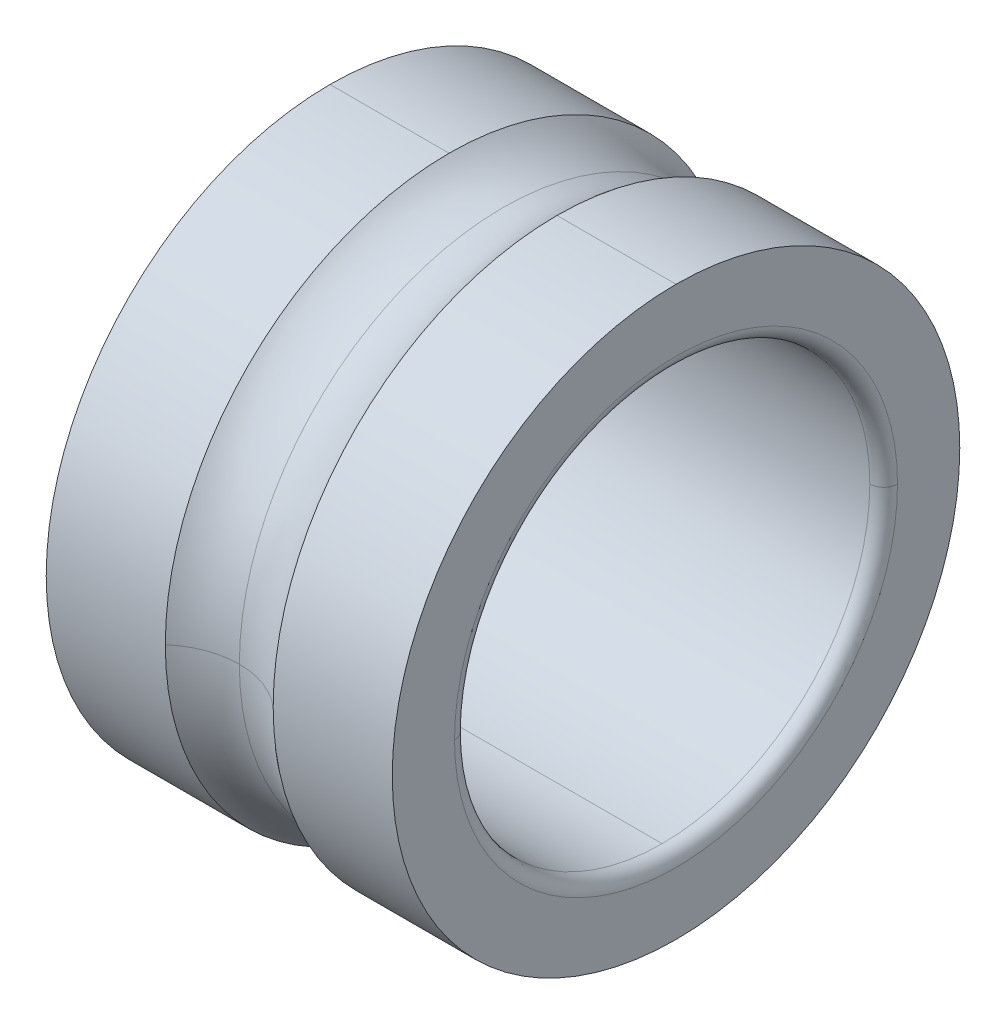
ISO-10303-21;
HEADER;
FILE_DESCRIPTION(('STEP AP214'),'2;1');
FILE_NAME('part.step','',(''),(''),'','','');
FILE_SCHEMA(('AUTOMOTIVE_DESIGN { 1 0 10303 214 1 1 1 1 }'));
ENDSEC;
DATA;
#1=APPLICATION_CONTEXT('core data for automotive mechanical design processes');
#2=APPLICATION_PROTOCOL_DEFINITION('international standard','automotive_design',2000,#1);
#3=PRODUCT_CONTEXT('',#1,'mechanical');
#4=PRODUCT('Part','Part','',(#3));
#5=PRODUCT_RELATED_PRODUCT_CATEGORY('part','',(#4));
#6=PRODUCT_DEFINITION_FORMATION('','',#4);
#7=PRODUCT_DEFINITION_CONTEXT('part definition',#1,'design');
#8=PRODUCT_DEFINITION('design','',#6,#7);
#9=PRODUCT_DEFINITION_SHAPE('','',#8);
#10=(LENGTH_UNIT() NAMED_UNIT(*) SI_UNIT(.MILLI.,.METRE.));
#11=(NAMED_UNIT(*) PLANE_ANGLE_UNIT() SI_UNIT($,.RADIAN.));
#12=(NAMED_UNIT(*) SI_UNIT($,.STERADIAN.) SOLID_ANGLE_UNIT());
#13=UNCERTAINTY_MEASURE_WITH_UNIT(LENGTH_MEASURE(1.E-05),#10,'distance_accuracy_value','');
#14=(GEOMETRIC_REPRESENTATION_CONTEXT(3) GLOBAL_UNCERTAINTY_ASSIGNED_CONTEXT((#13)) GLOBAL_UNIT_ASSIGNED_CONTEXT((#10,
#11,#12)) REPRESENTATION_CONTEXT('',''));
#15=CARTESIAN_POINT('',(0.,0.,0.));
#16=DIRECTION('',(0.,0.,1.));
#17=DIRECTION('',(1.,0.,0.));
#18=AXIS2_PLACEMENT_3D('',#15,#16,#17);
#19=CARTESIAN_POINT('',(4.13964414855096,0.,0.));
#20=DIRECTION('',(1.,0.,0.));
#21=DIRECTION('',(0.,1.,0.));
#22=AXIS2_PLACEMENT_3D('',#19,#20,#21);
#23=CYLINDRICAL_SURFACE('',#22,4.1);
#24=DIRECTION('',(1.,0.,0.));
#25=VECTOR('',#24,1.);
#26=CARTESIAN_POINT('',(4.13964414855096,4.1,0.));
#27=LINE('',#26,#25);
#28=CARTESIAN_POINT('',(3.27928829710191,4.1,0.));
#29=VERTEX_POINT('',#28);
#30=CARTESIAN_POINT('',(5.,4.1,0.));
#31=VERTEX_POINT('',#30);
#32=EDGE_CURVE('E150',#29,#31,#27,.T.);
#33=ORIENTED_EDGE('',*,*,#32,.T.);
#34=CARTESIAN_POINT('',(5.,0.,0.));
#35=DIRECTION('',(1.,0.,0.));
#36=DIRECTION('',(0.,1.,0.));
#37=AXIS2_PLACEMENT_3D('',#34,#35,#36);
#38=CIRCLE('',#37,4.1);
#39=CARTESIAN_POINT('',(5.,-4.1,0.));
#40=VERTEX_POINT('',#39);
#41=EDGE_CURVE('E136',#40,#31,#38,.T.);
#42=ORIENTED_EDGE('',*,*,#41,.F.);
#43=DIRECTION('',(-1.,0.,0.));
#44=VECTOR('',#43,1.);
#45=CARTESIAN_POINT('',(4.13964414855096,-4.1,0.));
#46=LINE('',#45,#44);
#47=CARTESIAN_POINT('',(3.27928829710191,-4.1,0.));
#48=VERTEX_POINT('',#47);
#49=EDGE_CURVE('E156',#40,#48,#46,.T.);
#50=ORIENTED_EDGE('',*,*,#49,.T.);
#51=CARTESIAN_POINT('',(3.27928829710191,0.,0.));
#52=DIRECTION('',(1.,0.,0.));
#53=DIRECTION('',(0.,1.,0.));
#54=AXIS2_PLACEMENT_3D('',#51,#52,#53);
#55=CIRCLE('',#54,4.1);
#56=CARTESIAN_POINT('',(3.27928829710191,0.,-4.1));
#57=VERTEX_POINT('',#56);
#58=EDGE_CURVE('E218',#48,#57,#55,.T.);
#59=ORIENTED_EDGE('',*,*,#58,.T.);
#60=CARTESIAN_POINT('',(3.27928829710191,0.,0.));
#61=DIRECTION('',(1.,0.,0.));
#62=DIRECTION('',(0.,1.,0.));
#63=AXIS2_PLACEMENT_3D('',#60,#61,#62);
#64=CIRCLE('',#63,4.1);
#65=EDGE_CURVE('E224',#57,#29,#64,.T.);
#66=ORIENTED_EDGE('',*,*,#65,.T.);
#67=EDGE_LOOP('',(#33,#42,#50,#59,#66));
#68=FACE_BOUND('',#67,.T.);
#69=ADVANCED_FACE('F16',(#68),#23,.T.);
#70=CARTESIAN_POINT('',(2.5,0.,0.));
#71=DIRECTION('',(1.,0.,0.));
#72=DIRECTION('',(0.,0.,-1.));
#73=AXIS2_PLACEMENT_3D('',#70,#71,#72);
#74=TOROIDAL_SURFACE('',#73,5.,1.1905);
#75=CARTESIAN_POINT('',(2.5,0.,0.));
#76=DIRECTION('',(-1.,0.,0.));
#77=DIRECTION('',(0.,0.,1.));
#78=AXIS2_PLACEMENT_3D('',#75,#76,#77);
#79=CIRCLE('',#78,3.8095);
#80=CARTESIAN_POINT('',(2.5,0.,3.8095));
#81=VERTEX_POINT('',#80);
#82=CARTESIAN_POINT('',(2.5,0.,-3.8095));
#83=VERTEX_POINT('',#82);
#84=EDGE_CURVE('E211',#81,#83,#79,.T.);
#85=ORIENTED_EDGE('',*,*,#84,.T.);
#86=CARTESIAN_POINT('',(2.5,0.,-5.));
#87=DIRECTION('',(0.,-1.,0.));
#88=DIRECTION('',(0.,0.,-1.));
#89=AXIS2_PLACEMENT_3D('',#86,#87,#88);
#90=CIRCLE('',#89,1.1905);
#91=CARTESIAN_POINT('',(1.72071170289809,0.,-4.1));
#92=VERTEX_POINT('',#91);
#93=EDGE_CURVE('E164',#83,#92,#90,.T.);
#94=ORIENTED_EDGE('',*,*,#93,.T.);
#95=CARTESIAN_POINT('',(1.72071170289809,0.,0.));
#96=DIRECTION('',(1.,0.,0.));
#97=DIRECTION('',(0.,1.,0.));
#98=AXIS2_PLACEMENT_3D('',#95,#96,#97);
#99=CIRCLE('',#98,4.1);
#100=CARTESIAN_POINT('',(1.72071170289809,4.1,0.));
#101=VERTEX_POINT('',#100);
#102=EDGE_CURVE('E11',#92,#101,#99,.T.);
#103=ORIENTED_EDGE('',*,*,#102,.T.);
#104=CARTESIAN_POINT('',(1.72071170289809,0.,0.));
#105=DIRECTION('',(1.,0.,0.));
#106=DIRECTION('',(0.,1.,0.));
#107=AXIS2_PLACEMENT_3D('',#104,#105,#106);
#108=CIRCLE('',#107,4.1);
#109=CARTESIAN_POINT('',(1.72071170289809,0.,4.1));
#110=VERTEX_POINT('',#109);
#111=EDGE_CURVE('E173',#101,#110,#108,.T.);
#112=ORIENTED_EDGE('',*,*,#111,.T.);
#113=CARTESIAN_POINT('',(2.5,0.,5.));
#114=DIRECTION('',(0.,-1.,0.));
#115=DIRECTION('',(0.,0.,1.));
#116=AXIS2_PLACEMENT_3D('',#113,#114,#115);
#117=CIRCLE('',#116,1.1905);
#118=EDGE_CURVE('E155',#110,#81,#117,.T.);
#119=ORIENTED_EDGE('',*,*,#118,.T.);
#120=EDGE_LOOP('',(#85,#94,#103,#112,#119));
#121=FACE_BOUND('',#120,.T.);
#122=ADVANCED_FACE('F251',(#121),#74,.F.);
#123=CARTESIAN_POINT('',(0.860355851449043,0.,0.));
#124=DIRECTION('',(1.,0.,0.));
#125=DIRECTION('',(0.,1.,0.));
#126=AXIS2_PLACEMENT_3D('',#123,#124,#125);
#127=CYLINDRICAL_SURFACE('',#126,4.1);
#128=DIRECTION('',(1.,0.,0.));
#129=VECTOR('',#128,1.);
#130=CARTESIAN_POINT('',(0.860355851449043,4.1,0.));
#131=LINE('',#130,#129);
#132=CARTESIAN_POINT('',(0.,4.1,0.));
#133=VERTEX_POINT('',#132);
#134=EDGE_CURVE('E167',#133,#101,#131,.T.);
#135=ORIENTED_EDGE('',*,*,#134,.T.);
#136=ORIENTED_EDGE('',*,*,#102,.F.);
#137=CARTESIAN_POINT('',(1.72071170289809,0.,0.));
#138=DIRECTION('',(1.,0.,0.));
#139=DIRECTION('',(0.,1.,0.));
#140=AXIS2_PLACEMENT_3D('',#137,#138,#139);
#141=CIRCLE('',#140,4.1);
#142=CARTESIAN_POINT('',(1.72071170289809,-4.1,0.));
#143=VERTEX_POINT('',#142);
#144=EDGE_CURVE('E161',#143,#92,#141,.T.);
#145=ORIENTED_EDGE('',*,*,#144,.F.);
#146=DIRECTION('',(-1.,0.,0.));
#147=VECTOR('',#146,1.);
#148=CARTESIAN_POINT('',(0.860355851449043,-4.1,0.));
#149=LINE('',#148,#147);
#150=CARTESIAN_POINT('',(0.,-4.1,0.));
#151=VERTEX_POINT('',#150);
#152=EDGE_CURVE('E171',#143,#151,#149,.T.);
#153=ORIENTED_EDGE('',*,*,#152,.T.);
#154=CARTESIAN_POINT('',(0.,0.,0.));
#155=DIRECTION('',(1.,0.,0.));
#156=DIRECTION('',(0.,1.,0.));
#157=AXIS2_PLACEMENT_3D('',#154,#155,#156);
#158=CIRCLE('',#157,4.1);
#159=EDGE_CURVE('E23',#151,#133,#158,.T.);
#160=ORIENTED_EDGE('',*,*,#159,.T.);
#161=EDGE_LOOP('',(#135,#136,#145,#153,#160));
#162=FACE_BOUND('',#161,.T.);
#163=ADVANCED_FACE('F201',(#162),#127,.T.);
#164=CARTESIAN_POINT('',(0.,3.65,0.));
#165=DIRECTION('',(-1.,0.,0.));
#166=DIRECTION('',(0.,0.,1.));
#167=AXIS2_PLACEMENT_3D('',#164,#165,#166);
#168=PLANE('',#167);
#169=CARTESIAN_POINT('',(0.,0.,0.));
#170=DIRECTION('',(1.,0.,0.));
#171=DIRECTION('',(0.,1.,0.));
#172=AXIS2_PLACEMENT_3D('',#169,#170,#171);
#173=CIRCLE('',#172,3.2);
#174=CARTESIAN_POINT('',(0.,0.,3.2));
#175=VERTEX_POINT('',#174);
#176=CARTESIAN_POINT('',(0.,0.,-3.2));
#177=VERTEX_POINT('',#176);
#178=EDGE_CURVE('E138',#175,#177,#173,.T.);
#179=ORIENTED_EDGE('',*,*,#178,.T.);
#180=CARTESIAN_POINT('',(0.,0.,0.));
#181=DIRECTION('',(1.,0.,0.));
#182=DIRECTION('',(0.,1.,0.));
#183=AXIS2_PLACEMENT_3D('',#180,#181,#182);
#184=CIRCLE('',#183,3.2);
#185=EDGE_CURVE('E187',#177,#175,#184,.T.);
#186=ORIENTED_EDGE('',*,*,#185,.T.);
#187=EDGE_LOOP('',(#179,#186));
#188=FACE_BOUND('',#187,.T.);
#189=CARTESIAN_POINT('',(0.,0.,0.));
#190=DIRECTION('',(1.,0.,0.));
#191=DIRECTION('',(0.,1.,0.));
#192=AXIS2_PLACEMENT_3D('',#189,#190,#191);
#193=CIRCLE('',#192,4.1);
#194=EDGE_CURVE('E168',#133,#151,#193,.T.);
#195=ORIENTED_EDGE('',*,*,#194,.F.);
#196=ORIENTED_EDGE('',*,*,#159,.F.);
#197=EDGE_LOOP('',(#195,#196));
#198=FACE_BOUND('',#197,.T.);
#199=ADVANCED_FACE('F198',(#188,#198),#168,.T.);
#200=CARTESIAN_POINT('',(0.2,0.,0.));
#201=DIRECTION('',(1.,0.,0.));
#202=DIRECTION('',(0.,0.,-1.));
#203=AXIS2_PLACEMENT_3D('',#200,#201,#202);
#204=TOROIDAL_SURFACE('',#203,3.2,0.2);
#205=CARTESIAN_POINT('',(0.2,0.,-3.2));
#206=DIRECTION('',(0.,-1.,0.));
#207=DIRECTION('',(0.,0.,-1.));
#208=AXIS2_PLACEMENT_3D('',#205,#206,#207);
#209=CIRCLE('',#208,0.2);
#210=CARTESIAN_POINT('',(0.2,0.,-3.));
#211=VERTEX_POINT('',#210);
#212=EDGE_CURVE('E175',#211,#177,#209,.T.);
#213=ORIENTED_EDGE('',*,*,#212,.T.);
#214=ORIENTED_EDGE('',*,*,#178,.F.);
#215=CARTESIAN_POINT('',(0.2,0.,3.2));
#216=DIRECTION('',(0.,-1.,0.));
#217=DIRECTION('',(0.,0.,1.));
#218=AXIS2_PLACEMENT_3D('',#215,#216,#217);
#219=CIRCLE('',#218,0.2);
#220=CARTESIAN_POINT('',(0.2,0.,3.));
#221=VERTEX_POINT('',#220);
#222=EDGE_CURVE('E184',#175,#221,#219,.T.);
#223=ORIENTED_EDGE('',*,*,#222,.T.);
#224=CARTESIAN_POINT('',(0.2,0.,0.));
#225=DIRECTION('',(1.,0.,0.));
#226=DIRECTION('',(0.,1.,0.));
#227=AXIS2_PLACEMENT_3D('',#224,#225,#226);
#228=CIRCLE('',#227,3.);
#229=CARTESIAN_POINT('',(0.2,-3.,0.));
#230=VERTEX_POINT('',#229);
#231=EDGE_CURVE('E137',#221,#230,#228,.T.);
#232=ORIENTED_EDGE('',*,*,#231,.T.);
#233=CARTESIAN_POINT('',(0.2,0.,0.));
#234=DIRECTION('',(1.,0.,0.));
#235=DIRECTION('',(0.,1.,0.));
#236=AXIS2_PLACEMENT_3D('',#233,#234,#235);
#237=CIRCLE('',#236,3.);
#238=EDGE_CURVE('E129',#230,#211,#237,.T.);
#239=ORIENTED_EDGE('',*,*,#238,.T.);
#240=EDGE_LOOP('',(#213,#214,#223,#232,#239));
#241=FACE_BOUND('',#240,.T.);
#242=ADVANCED_FACE('F192',(#241),#204,.T.);
#243=CARTESIAN_POINT('',(2.5,0.,0.));
#244=DIRECTION('',(1.,0.,0.));
#245=DIRECTION('',(0.,1.,0.));
#246=AXIS2_PLACEMENT_3D('',#243,#244,#245);
#247=CYLINDRICAL_SURFACE('',#246,3.);
#248=DIRECTION('',(1.,0.,0.));
#249=VECTOR('',#248,1.);
#250=CARTESIAN_POINT('',(2.5,3.,0.));
#251=LINE('',#250,#249);
#252=CARTESIAN_POINT('',(0.2,3.,0.));
#253=VERTEX_POINT('',#252);
#254=CARTESIAN_POINT('',(4.8,3.,0.));
#255=VERTEX_POINT('',#254);
#256=EDGE_CURVE('E189',#253,#255,#251,.T.);
#257=ORIENTED_EDGE('',*,*,#256,.T.);
#258=CARTESIAN_POINT('',(4.8,0.,0.));
#259=DIRECTION('',(1.,0.,0.));
#260=DIRECTION('',(0.,1.,0.));
#261=AXIS2_PLACEMENT_3D('',#258,#259,#260);
#262=CIRCLE('',#261,3.);
#263=CARTESIAN_POINT('',(4.8,0.,3.));
#264=VERTEX_POINT('',#263);
#265=EDGE_CURVE('E120',#255,#264,#262,.T.);
#266=ORIENTED_EDGE('',*,*,#265,.T.);
#267=CARTESIAN_POINT('',(4.8,0.,0.));
#268=DIRECTION('',(1.,0.,0.));
#269=DIRECTION('',(0.,1.,0.));
#270=AXIS2_PLACEMENT_3D('',#267,#268,#269);
#271=CIRCLE('',#270,3.);
#272=CARTESIAN_POINT('',(4.8,-3.,0.));
#273=VERTEX_POINT('',#272);
#274=EDGE_CURVE('E30',#264,#273,#271,.T.);
#275=ORIENTED_EDGE('',*,*,#274,.T.);
#276=DIRECTION('',(-1.,0.,0.));
#277=VECTOR('',#276,1.);
#278=CARTESIAN_POINT('',(2.5,-3.,0.));
#279=LINE('',#278,#277);
#280=EDGE_CURVE('E127',#273,#230,#279,.T.);
#281=ORIENTED_EDGE('',*,*,#280,.T.);
#282=ORIENTED_EDGE('',*,*,#231,.F.);
#283=CARTESIAN_POINT('',(0.2,0.,0.));
#284=DIRECTION('',(1.,0.,0.));
#285=DIRECTION('',(0.,1.,0.));
#286=AXIS2_PLACEMENT_3D('',#283,#284,#285);
#287=CIRCLE('',#286,3.);
#288=EDGE_CURVE('E181',#253,#221,#287,.T.);
#289=ORIENTED_EDGE('',*,*,#288,.F.);
#290=EDGE_LOOP('',(#257,#266,#275,#281,#282,#289));
#291=FACE_BOUND('',#290,.T.);
#292=ADVANCED_FACE('F277',(#291),#247,.F.);
#293=CARTESIAN_POINT('',(4.8,0.,0.));
#294=DIRECTION('',(1.,0.,0.));
#295=DIRECTION('',(0.,0.,-1.));
#296=AXIS2_PLACEMENT_3D('',#293,#294,#295);
#297=TOROIDAL_SURFACE('',#296,3.2,0.2);
#298=CARTESIAN_POINT('',(4.8,0.,-3.2));
#299=DIRECTION('',(0.,-1.,0.));
#300=DIRECTION('',(0.,0.,-1.));
#301=AXIS2_PLACEMENT_3D('',#298,#299,#300);
#302=CIRCLE('',#301,0.2);
#303=CARTESIAN_POINT('',(5.,0.,-3.2));
#304=VERTEX_POINT('',#303);
#305=CARTESIAN_POINT('',(4.8,0.,-3.));
#306=VERTEX_POINT('',#305);
#307=EDGE_CURVE('E106',#304,#306,#302,.T.);
#308=ORIENTED_EDGE('',*,*,#307,.T.);
#309=CARTESIAN_POINT('',(4.8,0.,0.));
#310=DIRECTION('',(1.,0.,0.));
#311=DIRECTION('',(0.,1.,0.));
#312=AXIS2_PLACEMENT_3D('',#309,#310,#311);
#313=CIRCLE('',#312,3.);
#314=EDGE_CURVE('E110',#273,#306,#313,.T.);
#315=ORIENTED_EDGE('',*,*,#314,.F.);
#316=ORIENTED_EDGE('',*,*,#274,.F.);
#317=CARTESIAN_POINT('',(4.8,0.,3.2));
#318=DIRECTION('',(0.,-1.,0.));
#319=DIRECTION('',(0.,0.,1.));
#320=AXIS2_PLACEMENT_3D('',#317,#318,#319);
#321=CIRCLE('',#320,0.2);
#322=CARTESIAN_POINT('',(5.,0.,3.2));
#323=VERTEX_POINT('',#322);
#324=EDGE_CURVE('E133',#264,#323,#321,.T.);
#325=ORIENTED_EDGE('',*,*,#324,.T.);
#326=CARTESIAN_POINT('',(5.,0.,0.));
#327=DIRECTION('',(1.,0.,0.));
#328=DIRECTION('',(0.,1.,0.));
#329=AXIS2_PLACEMENT_3D('',#326,#327,#328);
#330=CIRCLE('',#329,3.2);
#331=EDGE_CURVE('E38',#323,#304,#330,.T.);
#332=ORIENTED_EDGE('',*,*,#331,.T.);
#333=EDGE_LOOP('',(#308,#315,#316,#325,#332));
#334=FACE_BOUND('',#333,.T.);
#335=ADVANCED_FACE('F108',(#334),#297,.T.);
#336=CARTESIAN_POINT('',(5.,3.65,0.));
#337=DIRECTION('',(1.,0.,0.));
#338=DIRECTION('',(0.,1.,0.));
#339=AXIS2_PLACEMENT_3D('',#336,#337,#338);
#340=PLANE('',#339);
#341=CARTESIAN_POINT('',(5.,0.,0.));
#342=DIRECTION('',(1.,0.,0.));
#343=DIRECTION('',(0.,1.,0.));
#344=AXIS2_PLACEMENT_3D('',#341,#342,#343);
#345=CIRCLE('',#344,3.2);
#346=EDGE_CURVE('E114',#304,#323,#345,.T.);
#347=ORIENTED_EDGE('',*,*,#346,.F.);
#348=ORIENTED_EDGE('',*,*,#331,.F.);
#349=EDGE_LOOP('',(#347,#348));
#350=FACE_BOUND('',#349,.T.);
#351=CARTESIAN_POINT('',(5.,0.,0.));
#352=DIRECTION('',(1.,0.,0.));
#353=DIRECTION('',(0.,1.,0.));
#354=AXIS2_PLACEMENT_3D('',#351,#352,#353);
#355=CIRCLE('',#354,4.1);
#356=EDGE_CURVE('E152',#31,#40,#355,.T.);
#357=ORIENTED_EDGE('',*,*,#356,.T.);
#358=ORIENTED_EDGE('',*,*,#41,.T.);
#359=EDGE_LOOP('',(#357,#358));
#360=FACE_BOUND('',#359,.T.);
#361=ADVANCED_FACE('F269',(#350,#360),#340,.T.);
#362=CARTESIAN_POINT('',(4.8,0.,0.));
#363=DIRECTION('',(1.,0.,0.));
#364=DIRECTION('',(0.,0.,-1.));
#365=AXIS2_PLACEMENT_3D('',#362,#363,#364);
#366=TOROIDAL_SURFACE('',#365,3.2,0.2);
#367=ORIENTED_EDGE('',*,*,#307,.F.);
#368=ORIENTED_EDGE('',*,*,#346,.T.);
#369=ORIENTED_EDGE('',*,*,#324,.F.);
#370=ORIENTED_EDGE('',*,*,#265,.F.);
#371=CARTESIAN_POINT('',(4.8,0.,0.));
#372=DIRECTION('',(1.,0.,0.));
#373=DIRECTION('',(0.,1.,0.));
#374=AXIS2_PLACEMENT_3D('',#371,#372,#373);
#375=CIRCLE('',#374,3.);
#376=EDGE_CURVE('E115',#306,#255,#375,.T.);
#377=ORIENTED_EDGE('',*,*,#376,.F.);
#378=EDGE_LOOP('',(#367,#368,#369,#370,#377));
#379=FACE_BOUND('',#378,.T.);
#380=ADVANCED_FACE('F118',(#379),#366,.T.);
#381=CARTESIAN_POINT('',(2.5,0.,0.));
#382=DIRECTION('',(1.,0.,0.));
#383=DIRECTION('',(0.,1.,0.));
#384=AXIS2_PLACEMENT_3D('',#381,#382,#383);
#385=CYLINDRICAL_SURFACE('',#384,3.);
#386=ORIENTED_EDGE('',*,*,#256,.F.);
#387=CARTESIAN_POINT('',(0.2,0.,0.));
#388=DIRECTION('',(1.,0.,0.));
#389=DIRECTION('',(0.,1.,0.));
#390=AXIS2_PLACEMENT_3D('',#387,#388,#389);
#391=CIRCLE('',#390,3.);
#392=EDGE_CURVE('E178',#211,#253,#391,.T.);
#393=ORIENTED_EDGE('',*,*,#392,.F.);
#394=ORIENTED_EDGE('',*,*,#238,.F.);
#395=ORIENTED_EDGE('',*,*,#280,.F.);
#396=ORIENTED_EDGE('',*,*,#314,.T.);
#397=ORIENTED_EDGE('',*,*,#376,.T.);
#398=EDGE_LOOP('',(#386,#393,#394,#395,#396,#397));
#399=FACE_BOUND('',#398,.T.);
#400=ADVANCED_FACE('F124',(#399),#385,.F.);
#401=CARTESIAN_POINT('',(0.2,0.,0.));
#402=DIRECTION('',(1.,0.,0.));
#403=DIRECTION('',(0.,0.,-1.));
#404=AXIS2_PLACEMENT_3D('',#401,#402,#403);
#405=TOROIDAL_SURFACE('',#404,3.2,0.2);
#406=ORIENTED_EDGE('',*,*,#212,.F.);
#407=ORIENTED_EDGE('',*,*,#392,.T.);
#408=ORIENTED_EDGE('',*,*,#288,.T.);
#409=ORIENTED_EDGE('',*,*,#222,.F.);
#410=ORIENTED_EDGE('',*,*,#185,.F.);
#411=EDGE_LOOP('',(#406,#407,#408,#409,#410));
#412=FACE_BOUND('',#411,.T.);
#413=ADVANCED_FACE('F196',(#412),#405,.T.);
#414=CARTESIAN_POINT('',(0.860355851449043,0.,0.));
#415=DIRECTION('',(1.,0.,0.));
#416=DIRECTION('',(0.,1.,0.));
#417=AXIS2_PLACEMENT_3D('',#414,#415,#416);
#418=CYLINDRICAL_SURFACE('',#417,4.1);
#419=ORIENTED_EDGE('',*,*,#134,.F.);
#420=ORIENTED_EDGE('',*,*,#194,.T.);
#421=ORIENTED_EDGE('',*,*,#152,.F.);
#422=CARTESIAN_POINT('',(1.72071170289809,0.,0.));
#423=DIRECTION('',(1.,0.,0.));
#424=DIRECTION('',(0.,1.,0.));
#425=AXIS2_PLACEMENT_3D('',#422,#423,#424);
#426=CIRCLE('',#425,4.1);
#427=EDGE_CURVE('E158',#110,#143,#426,.T.);
#428=ORIENTED_EDGE('',*,*,#427,.F.);
#429=ORIENTED_EDGE('',*,*,#111,.F.);
#430=EDGE_LOOP('',(#419,#420,#421,#428,#429));
#431=FACE_BOUND('',#430,.T.);
#432=ADVANCED_FACE('F206',(#431),#418,.T.);
#433=CARTESIAN_POINT('',(2.5,0.,0.));
#434=DIRECTION('',(1.,0.,0.));
#435=DIRECTION('',(0.,0.,-1.));
#436=AXIS2_PLACEMENT_3D('',#433,#434,#435);
#437=TOROIDAL_SURFACE('',#436,5.,1.1905);
#438=CARTESIAN_POINT('',(2.5,0.,0.));
#439=DIRECTION('',(-1.,0.,0.));
#440=DIRECTION('',(0.,0.,1.));
#441=AXIS2_PLACEMENT_3D('',#438,#439,#440);
#442=CIRCLE('',#441,3.8095);
#443=EDGE_CURVE('E221',#83,#81,#442,.T.);
#444=ORIENTED_EDGE('',*,*,#443,.T.);
#445=ORIENTED_EDGE('',*,*,#118,.F.);
#446=ORIENTED_EDGE('',*,*,#427,.T.);
#447=ORIENTED_EDGE('',*,*,#144,.T.);
#448=ORIENTED_EDGE('',*,*,#93,.F.);
#449=EDGE_LOOP('',(#444,#445,#446,#447,#448));
#450=FACE_BOUND('',#449,.T.);
#451=ADVANCED_FACE('F240',(#450),#437,.F.);
#452=CARTESIAN_POINT('',(4.13964414855096,0.,0.));
#453=DIRECTION('',(1.,0.,0.));
#454=DIRECTION('',(0.,1.,0.));
#455=AXIS2_PLACEMENT_3D('',#452,#453,#454);
#456=CYLINDRICAL_SURFACE('',#455,4.1);
#457=ORIENTED_EDGE('',*,*,#32,.F.);
#458=CARTESIAN_POINT('',(3.27928829710191,0.,0.));
#459=DIRECTION('',(1.,0.,0.));
#460=DIRECTION('',(0.,1.,0.));
#461=AXIS2_PLACEMENT_3D('',#458,#459,#460);
#462=CIRCLE('',#461,4.1);
#463=CARTESIAN_POINT('',(3.27928829710191,0.,4.1));
#464=VERTEX_POINT('',#463);
#465=EDGE_CURVE('E217',#29,#464,#462,.T.);
#466=ORIENTED_EDGE('',*,*,#465,.T.);
#467=CARTESIAN_POINT('',(3.27928829710191,0.,0.));
#468=DIRECTION('',(1.,0.,0.));
#469=DIRECTION('',(0.,1.,0.));
#470=AXIS2_PLACEMENT_3D('',#467,#468,#469);
#471=CIRCLE('',#470,4.1);
#472=EDGE_CURVE('E220',#464,#48,#471,.T.);
#473=ORIENTED_EDGE('',*,*,#472,.T.);
#474=ORIENTED_EDGE('',*,*,#49,.F.);
#475=ORIENTED_EDGE('',*,*,#356,.F.);
#476=EDGE_LOOP('',(#457,#466,#473,#474,#475));
#477=FACE_BOUND('',#476,.T.);
#478=ADVANCED_FACE('F266',(#477),#456,.T.);
#479=CARTESIAN_POINT('',(2.5,0.,0.));
#480=DIRECTION('',(1.,0.,0.));
#481=DIRECTION('',(0.,0.,-1.));
#482=AXIS2_PLACEMENT_3D('',#479,#480,#481);
#483=TOROIDAL_SURFACE('',#482,5.,1.1905);
#484=ORIENTED_EDGE('',*,*,#443,.F.);
#485=CARTESIAN_POINT('',(2.5,0.,-5.));
#486=DIRECTION('',(0.,-1.,0.));
#487=DIRECTION('',(0.,0.,-1.));
#488=AXIS2_PLACEMENT_3D('',#485,#486,#487);
#489=CIRCLE('',#488,1.1905);
#490=EDGE_CURVE('E230',#57,#83,#489,.T.);
#491=ORIENTED_EDGE('',*,*,#490,.F.);
#492=ORIENTED_EDGE('',*,*,#58,.F.);
#493=ORIENTED_EDGE('',*,*,#472,.F.);
#494=CARTESIAN_POINT('',(2.5,0.,5.));
#495=DIRECTION('',(0.,-1.,0.));
#496=DIRECTION('',(0.,0.,1.));
#497=AXIS2_PLACEMENT_3D('',#494,#495,#496);
#498=CIRCLE('',#497,1.1905);
#499=EDGE_CURVE('E214',#81,#464,#498,.T.);
#500=ORIENTED_EDGE('',*,*,#499,.F.);
#501=EDGE_LOOP('',(#484,#491,#492,#493,#500));
#502=FACE_BOUND('',#501,.T.);
#503=ADVANCED_FACE('F244',(#502),#483,.F.);
#504=CARTESIAN_POINT('',(2.5,0.,0.));
#505=DIRECTION('',(1.,0.,0.));
#506=DIRECTION('',(0.,0.,-1.));
#507=AXIS2_PLACEMENT_3D('',#504,#505,#506);
#508=TOROIDAL_SURFACE('',#507,5.,1.1905);
#509=ORIENTED_EDGE('',*,*,#84,.F.);
#510=ORIENTED_EDGE('',*,*,#499,.T.);
#511=ORIENTED_EDGE('',*,*,#465,.F.);
#512=ORIENTED_EDGE('',*,*,#65,.F.);
#513=ORIENTED_EDGE('',*,*,#490,.T.);
#514=EDGE_LOOP('',(#509,#510,#511,#512,#513));
#515=FACE_BOUND('',#514,.T.);
#516=ADVANCED_FACE('F248',(#515),#508,.F.);
#517=CLOSED_SHELL('',(#69,#122,#163,#199,#242,#292,#335,#361,#380,#400,#413,#432,#451,#478,#503,#516));
#518=MANIFOLD_SOLID_BREP('B1',#517);
#519=ADVANCED_BREP_SHAPE_REPRESENTATION('',(#18,#518),#14);
#520=SHAPE_DEFINITION_REPRESENTATION(#9,#519);
ENDSEC;
END-ISO-10303-21;
